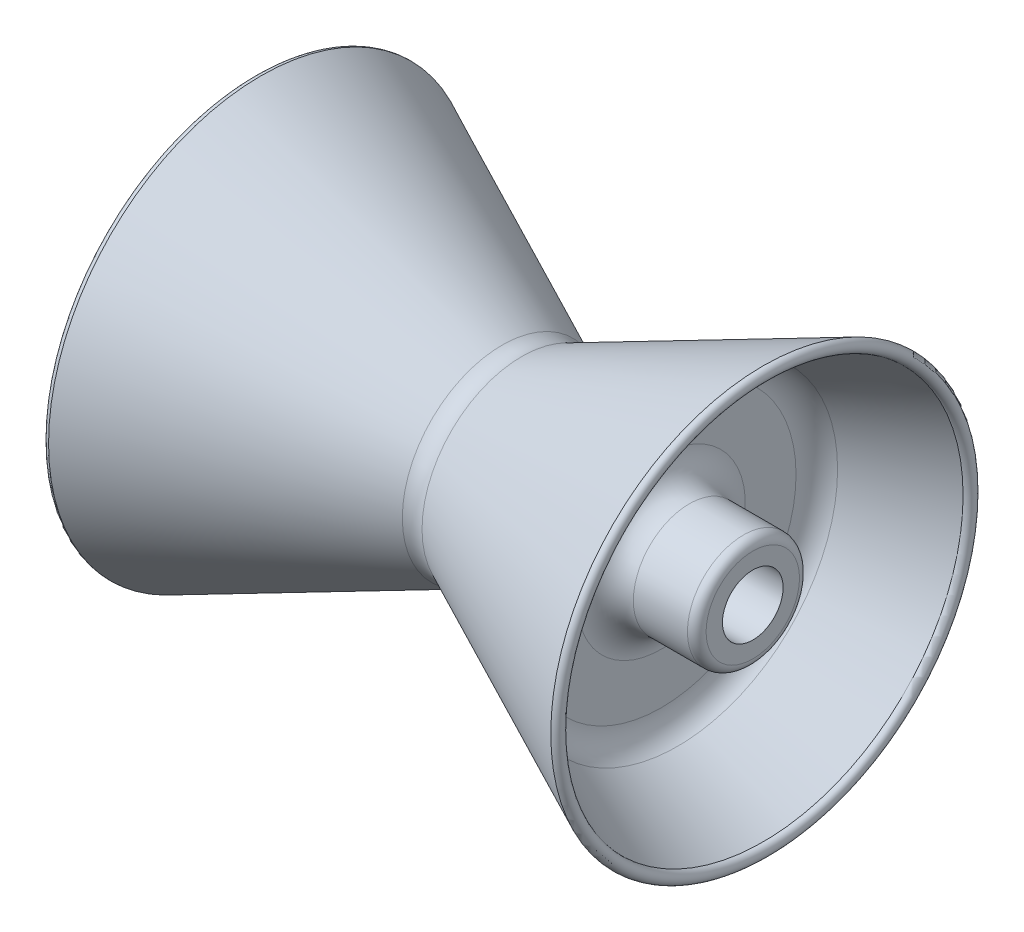
ISO-10303-21;
HEADER;
FILE_DESCRIPTION(('STEP AP214'),'2;1');
FILE_NAME('part.step','',(''),(''),'','','');
FILE_SCHEMA(('AUTOMOTIVE_DESIGN { 1 0 10303 214 1 1 1 1 }'));
ENDSEC;
DATA;
#1=APPLICATION_CONTEXT('core data for automotive mechanical design processes');
#2=APPLICATION_PROTOCOL_DEFINITION('international standard','automotive_design',2000,#1);
#3=PRODUCT_CONTEXT('',#1,'mechanical');
#4=PRODUCT('Part','Part','',(#3));
#5=PRODUCT_RELATED_PRODUCT_CATEGORY('part','',(#4));
#6=PRODUCT_DEFINITION_FORMATION('','',#4);
#7=PRODUCT_DEFINITION_CONTEXT('part definition',#1,'design');
#8=PRODUCT_DEFINITION('design','',#6,#7);
#9=PRODUCT_DEFINITION_SHAPE('','',#8);
#10=(LENGTH_UNIT() NAMED_UNIT(*) SI_UNIT(.MILLI.,.METRE.));
#11=(NAMED_UNIT(*) PLANE_ANGLE_UNIT() SI_UNIT($,.RADIAN.));
#12=(NAMED_UNIT(*) SI_UNIT($,.STERADIAN.) SOLID_ANGLE_UNIT());
#13=UNCERTAINTY_MEASURE_WITH_UNIT(LENGTH_MEASURE(1.E-05),#10,'distance_accuracy_value','');
#14=(GEOMETRIC_REPRESENTATION_CONTEXT(3) GLOBAL_UNCERTAINTY_ASSIGNED_CONTEXT((#13)) GLOBAL_UNIT_ASSIGNED_CONTEXT((#10,
#11,#12)) REPRESENTATION_CONTEXT('',''));
#15=CARTESIAN_POINT('',(0.,0.,0.));
#16=DIRECTION('',(0.,0.,1.));
#17=DIRECTION('',(1.,0.,0.));
#18=AXIS2_PLACEMENT_3D('',#15,#16,#17);
#19=CARTESIAN_POINT('',(-269.015,0.,0.));
#20=DIRECTION('',(-1.,0.,0.));
#21=DIRECTION('',(0.,0.,1.));
#22=AXIS2_PLACEMENT_3D('',#19,#20,#21);
#23=TOROIDAL_SURFACE('',#22,220.839732486225,6.62026751377497);
#24=CARTESIAN_POINT('',(-269.015,0.,0.));
#25=DIRECTION('',(-1.,0.,0.));
#26=DIRECTION('',(0.,0.,1.));
#27=AXIS2_PLACEMENT_3D('',#24,#25,#26);
#28=CIRCLE('',#27,214.21946497245);
#29=CARTESIAN_POINT('',(-269.015,0.,214.21946497245));
#30=VERTEX_POINT('',#29);
#31=EDGE_CURVE('E10',#30,#30,#28,.T.);
#32=ORIENTED_EDGE('',*,*,#31,.F.);
#33=EDGE_LOOP('',(#32));
#34=FACE_BOUND('',#33,.T.);
#35=CARTESIAN_POINT('',(-269.015,0.,0.));
#36=DIRECTION('',(-1.,0.,0.));
#37=DIRECTION('',(0.,0.,1.));
#38=AXIS2_PLACEMENT_3D('',#35,#36,#37);
#39=CIRCLE('',#38,227.46);
#40=CARTESIAN_POINT('',(-269.015,0.,227.46));
#41=VERTEX_POINT('',#40);
#42=EDGE_CURVE('E128',#41,#41,#39,.T.);
#43=ORIENTED_EDGE('',*,*,#42,.T.);
#44=EDGE_LOOP('',(#43));
#45=FACE_BOUND('',#44,.T.);
#46=ADVANCED_FACE('F37',(#34,#45),#23,.T.);
#47=CARTESIAN_POINT('',(-269.015,0.,0.));
#48=DIRECTION('',(-1.,0.,0.));
#49=DIRECTION('',(0.,0.,1.));
#50=AXIS2_PLACEMENT_3D('',#47,#48,#49);
#51=CONICAL_SURFACE('',#50,214.21946497245,0.43633231299858);
#52=CARTESIAN_POINT('',(-177.321452147779,0.,0.));
#53=DIRECTION('',(-1.,0.,0.));
#54=DIRECTION('',(0.,0.,1.));
#55=AXIS2_PLACEMENT_3D('',#52,#53,#54);
#56=CIRCLE('',#55,171.462061405558);
#57=CARTESIAN_POINT('',(-177.321452147779,0.,171.462061405558));
#58=VERTEX_POINT('',#57);
#59=EDGE_CURVE('E43',#58,#58,#56,.T.);
#60=ORIENTED_EDGE('',*,*,#59,.F.);
#61=EDGE_LOOP('',(#60));
#62=FACE_BOUND('',#61,.T.);
#63=ORIENTED_EDGE('',*,*,#31,.T.);
#64=EDGE_LOOP('',(#63));
#65=FACE_BOUND('',#64,.T.);
#66=ADVANCED_FACE('F291',(#62,#65),#51,.F.);
#67=CARTESIAN_POINT('',(-190.,0.,0.));
#68=DIRECTION('',(-1.,0.,0.));
#69=DIRECTION('',(0.,0.,1.));
#70=AXIS2_PLACEMENT_3D('',#67,#68,#69);
#71=TOROIDAL_SURFACE('',#70,144.272827794458,30.);
#72=CARTESIAN_POINT('',(-160.,0.,0.));
#73=DIRECTION('',(-1.,0.,0.));
#74=DIRECTION('',(0.,0.,1.));
#75=AXIS2_PLACEMENT_3D('',#72,#73,#74);
#76=CIRCLE('',#75,144.272827794458);
#77=CARTESIAN_POINT('',(-160.,0.,144.272827794458));
#78=VERTEX_POINT('',#77);
#79=EDGE_CURVE('E47',#78,#78,#76,.T.);
#80=ORIENTED_EDGE('',*,*,#79,.F.);
#81=EDGE_LOOP('',(#80));
#82=FACE_BOUND('',#81,.T.);
#83=ORIENTED_EDGE('',*,*,#59,.T.);
#84=EDGE_LOOP('',(#83));
#85=FACE_BOUND('',#84,.T.);
#86=ADVANCED_FACE('F286',(#82,#85),#71,.F.);
#87=CARTESIAN_POINT('',(-160.,90.0000000000002,0.));
#88=DIRECTION('',(1.,0.,0.));
#89=DIRECTION('',(0.,0.,-1.));
#90=AXIS2_PLACEMENT_3D('',#87,#88,#89);
#91=PLANE('',#90);
#92=CARTESIAN_POINT('',(-160.,0.,0.));
#93=DIRECTION('',(-1.,0.,0.));
#94=DIRECTION('',(0.,0.,1.));
#95=AXIS2_PLACEMENT_3D('',#92,#93,#94);
#96=CIRCLE('',#95,90.0000000000002);
#97=CARTESIAN_POINT('',(-160.,0.,90.0000000000002));
#98=VERTEX_POINT('',#97);
#99=EDGE_CURVE('E51',#98,#98,#96,.T.);
#100=ORIENTED_EDGE('',*,*,#99,.F.);
#101=EDGE_LOOP('',(#100));
#102=FACE_BOUND('',#101,.T.);
#103=ORIENTED_EDGE('',*,*,#79,.T.);
#104=EDGE_LOOP('',(#103));
#105=FACE_BOUND('',#104,.T.);
#106=ADVANCED_FACE('F280',(#102,#105),#91,.F.);
#107=CARTESIAN_POINT('',(-190.,0.,0.));
#108=DIRECTION('',(-1.,0.,0.));
#109=DIRECTION('',(0.,0.,1.));
#110=AXIS2_PLACEMENT_3D('',#107,#108,#109);
#111=TOROIDAL_SURFACE('',#110,90.,30.);
#112=CARTESIAN_POINT('',(-190.,0.,0.));
#113=DIRECTION('',(-1.,0.,0.));
#114=DIRECTION('',(0.,0.,1.));
#115=AXIS2_PLACEMENT_3D('',#112,#113,#114);
#116=CIRCLE('',#115,60.);
#117=CARTESIAN_POINT('',(-190.,0.,60.));
#118=VERTEX_POINT('',#117);
#119=EDGE_CURVE('E56',#118,#118,#116,.T.);
#120=ORIENTED_EDGE('',*,*,#119,.F.);
#121=EDGE_LOOP('',(#120));
#122=FACE_BOUND('',#121,.T.);
#123=ORIENTED_EDGE('',*,*,#99,.T.);
#124=EDGE_LOOP('',(#123));
#125=FACE_BOUND('',#124,.T.);
#126=ADVANCED_FACE('F274',(#122,#125),#111,.F.);
#127=CARTESIAN_POINT('',(-289.83870967742,0.,0.));
#128=DIRECTION('',(-1.,0.,0.));
#129=DIRECTION('',(0.,0.,1.));
#130=AXIS2_PLACEMENT_3D('',#127,#128,#129);
#131=CYLINDRICAL_SURFACE('',#130,60.);
#132=CARTESIAN_POINT('',(-247.940415619254,0.,0.));
#133=DIRECTION('',(-1.,0.,0.));
#134=DIRECTION('',(0.,0.,1.));
#135=AXIS2_PLACEMENT_3D('',#132,#133,#134);
#136=CIRCLE('',#135,60.);
#137=CARTESIAN_POINT('',(-247.940415619254,0.,60.));
#138=VERTEX_POINT('',#137);
#139=EDGE_CURVE('E59',#138,#138,#136,.T.);
#140=ORIENTED_EDGE('',*,*,#139,.F.);
#141=EDGE_LOOP('',(#140));
#142=FACE_BOUND('',#141,.T.);
#143=ORIENTED_EDGE('',*,*,#119,.T.);
#144=EDGE_LOOP('',(#143));
#145=FACE_BOUND('',#144,.T.);
#146=ADVANCED_FACE('F268',(#142,#145),#131,.T.);
#147=CARTESIAN_POINT('',(-247.940415619254,0.,0.));
#148=DIRECTION('',(-1.,0.,0.));
#149=DIRECTION('',(0.,0.,1.));
#150=AXIS2_PLACEMENT_3D('',#147,#148,#149);
#151=TOROIDAL_SURFACE('',#150,50.,10.);
#152=CARTESIAN_POINT('',(-257.940415619254,0.,0.));
#153=DIRECTION('',(-1.,0.,0.));
#154=DIRECTION('',(0.,0.,1.));
#155=AXIS2_PLACEMENT_3D('',#152,#153,#154);
#156=CIRCLE('',#155,49.9999999999999);
#157=CARTESIAN_POINT('',(-257.940415619254,0.,49.9999999999999));
#158=VERTEX_POINT('',#157);
#159=EDGE_CURVE('E62',#158,#158,#156,.T.);
#160=ORIENTED_EDGE('',*,*,#159,.F.);
#161=EDGE_LOOP('',(#160));
#162=FACE_BOUND('',#161,.T.);
#163=ORIENTED_EDGE('',*,*,#139,.T.);
#164=EDGE_LOOP('',(#163));
#165=FACE_BOUND('',#164,.T.);
#166=ADVANCED_FACE('F262',(#162,#165),#151,.T.);
#167=CARTESIAN_POINT('',(-257.940415619254,32.5,0.));
#168=DIRECTION('',(1.,0.,0.));
#169=DIRECTION('',(0.,0.,-1.));
#170=AXIS2_PLACEMENT_3D('',#167,#168,#169);
#171=PLANE('',#170);
#172=CARTESIAN_POINT('',(-257.940415619254,0.,0.));
#173=DIRECTION('',(-1.,0.,0.));
#174=DIRECTION('',(0.,0.,1.));
#175=AXIS2_PLACEMENT_3D('',#172,#173,#174);
#176=CIRCLE('',#175,32.5);
#177=CARTESIAN_POINT('',(-257.940415619254,0.,32.5));
#178=VERTEX_POINT('',#177);
#179=EDGE_CURVE('E65',#178,#178,#176,.T.);
#180=ORIENTED_EDGE('',*,*,#179,.F.);
#181=EDGE_LOOP('',(#180));
#182=FACE_BOUND('',#181,.T.);
#183=ORIENTED_EDGE('',*,*,#159,.T.);
#184=EDGE_LOOP('',(#183));
#185=FACE_BOUND('',#184,.T.);
#186=ADVANCED_FACE('F256',(#182,#185),#171,.F.);
#187=CARTESIAN_POINT('',(-289.83870967742,0.,0.));
#188=DIRECTION('',(-1.,0.,0.));
#189=DIRECTION('',(0.,0.,1.));
#190=AXIS2_PLACEMENT_3D('',#187,#188,#189);
#191=CYLINDRICAL_SURFACE('',#190,32.5);
#192=CARTESIAN_POINT('',(-130.,0.,0.));
#193=DIRECTION('',(-1.,0.,0.));
#194=DIRECTION('',(0.,0.,1.));
#195=AXIS2_PLACEMENT_3D('',#192,#193,#194);
#196=CIRCLE('',#195,32.5);
#197=CARTESIAN_POINT('',(-130.,0.,32.5));
#198=VERTEX_POINT('',#197);
#199=EDGE_CURVE('E68',#198,#198,#196,.T.);
#200=ORIENTED_EDGE('',*,*,#199,.F.);
#201=EDGE_LOOP('',(#200));
#202=FACE_BOUND('',#201,.T.);
#203=ORIENTED_EDGE('',*,*,#179,.T.);
#204=EDGE_LOOP('',(#203));
#205=FACE_BOUND('',#204,.T.);
#206=ADVANCED_FACE('F250',(#202,#205),#191,.F.);
#207=CARTESIAN_POINT('',(-130.,102.305138560509,0.));
#208=DIRECTION('',(-1.,0.,0.));
#209=DIRECTION('',(0.,0.,1.));
#210=AXIS2_PLACEMENT_3D('',#207,#208,#209);
#211=PLANE('',#210);
#212=CARTESIAN_POINT('',(-130.,0.,0.));
#213=DIRECTION('',(-1.,0.,0.));
#214=DIRECTION('',(0.,0.,1.));
#215=AXIS2_PLACEMENT_3D('',#212,#213,#214);
#216=CIRCLE('',#215,102.305138560509);
#217=CARTESIAN_POINT('',(-130.,0.,102.305138560509));
#218=VERTEX_POINT('',#217);
#219=EDGE_CURVE('E71',#218,#218,#216,.T.);
#220=ORIENTED_EDGE('',*,*,#219,.F.);
#221=EDGE_LOOP('',(#220));
#222=FACE_BOUND('',#221,.T.);
#223=ORIENTED_EDGE('',*,*,#199,.T.);
#224=EDGE_LOOP('',(#223));
#225=FACE_BOUND('',#224,.T.);
#226=ADVANCED_FACE('F244',(#222,#225),#211,.F.);
#227=CARTESIAN_POINT('',(-100.,0.,0.));
#228=DIRECTION('',(-1.,0.,0.));
#229=DIRECTION('',(0.,0.,1.));
#230=AXIS2_PLACEMENT_3D('',#227,#228,#229);
#231=TOROIDAL_SURFACE('',#230,102.305138560509,30.);
#232=CARTESIAN_POINT('',(-87.3214521477791,0.,0.));
#233=DIRECTION('',(-1.,0.,0.));
#234=DIRECTION('',(0.,0.,1.));
#235=AXIS2_PLACEMENT_3D('',#232,#233,#234);
#236=CIRCLE('',#235,129.494372171608);
#237=CARTESIAN_POINT('',(-87.3214521477791,0.,129.494372171608));
#238=VERTEX_POINT('',#237);
#239=EDGE_CURVE('E74',#238,#238,#236,.T.);
#240=ORIENTED_EDGE('',*,*,#239,.F.);
#241=EDGE_LOOP('',(#240));
#242=FACE_BOUND('',#241,.T.);
#243=ORIENTED_EDGE('',*,*,#219,.T.);
#244=EDGE_LOOP('',(#243));
#245=FACE_BOUND('',#244,.T.);
#246=ADVANCED_FACE('F238',(#242,#245),#231,.F.);
#247=CARTESIAN_POINT('',(-87.3214521477791,0.,0.));
#248=DIRECTION('',(-1.,0.,0.));
#249=DIRECTION('',(0.,0.,1.));
#250=AXIS2_PLACEMENT_3D('',#247,#248,#249);
#251=CONICAL_SURFACE('',#250,129.494372171608,0.43633231299858);
#252=CARTESIAN_POINT('',(-2.88690869129654,0.,0.));
#253=DIRECTION('',(-1.,0.,0.));
#254=DIRECTION('',(0.,0.,1.));
#255=AXIS2_PLACEMENT_3D('',#252,#253,#254);
#256=CIRCLE('',#255,90.1218979450298);
#257=CARTESIAN_POINT('',(-2.88690869129654,0.,90.1218979450298));
#258=VERTEX_POINT('',#257);
#259=EDGE_CURVE('E77',#258,#258,#256,.T.);
#260=ORIENTED_EDGE('',*,*,#259,.F.);
#261=EDGE_LOOP('',(#260));
#262=FACE_BOUND('',#261,.T.);
#263=ORIENTED_EDGE('',*,*,#239,.T.);
#264=EDGE_LOOP('',(#263));
#265=FACE_BOUND('',#264,.T.);
#266=ADVANCED_FACE('F232',(#262,#265),#251,.F.);
#267=CARTESIAN_POINT('',(-5.,0.,0.));
#268=DIRECTION('',(-1.,0.,0.));
#269=DIRECTION('',(0.,0.,1.));
#270=AXIS2_PLACEMENT_3D('',#267,#268,#269);
#271=TOROIDAL_SURFACE('',#270,85.5903590098465,5.);
#272=CARTESIAN_POINT('',(0.,0.,0.));
#273=DIRECTION('',(-1.,0.,0.));
#274=DIRECTION('',(0.,0.,1.));
#275=AXIS2_PLACEMENT_3D('',#272,#273,#274);
#276=CIRCLE('',#275,85.5903590098465);
#277=CARTESIAN_POINT('',(0.,0.,85.5903590098465));
#278=VERTEX_POINT('',#277);
#279=EDGE_CURVE('E80',#278,#278,#276,.T.);
#280=ORIENTED_EDGE('',*,*,#279,.F.);
#281=EDGE_LOOP('',(#280));
#282=FACE_BOUND('',#281,.T.);
#283=ORIENTED_EDGE('',*,*,#259,.T.);
#284=EDGE_LOOP('',(#283));
#285=FACE_BOUND('',#284,.T.);
#286=ADVANCED_FACE('F226',(#282,#285),#271,.F.);
#287=CARTESIAN_POINT('',(5.,0.,0.));
#288=DIRECTION('',(-1.,0.,0.));
#289=DIRECTION('',(0.,0.,1.));
#290=AXIS2_PLACEMENT_3D('',#287,#288,#289);
#291=TOROIDAL_SURFACE('',#290,85.5903590098465,5.);
#292=CARTESIAN_POINT('',(2.88690869129654,0.,0.));
#293=DIRECTION('',(-1.,0.,0.));
#294=DIRECTION('',(0.,0.,1.));
#295=AXIS2_PLACEMENT_3D('',#292,#293,#294);
#296=CIRCLE('',#295,90.1218979450298);
#297=CARTESIAN_POINT('',(2.88690869129654,0.,90.1218979450298));
#298=VERTEX_POINT('',#297);
#299=EDGE_CURVE('E83',#298,#298,#296,.T.);
#300=ORIENTED_EDGE('',*,*,#299,.F.);
#301=EDGE_LOOP('',(#300));
#302=FACE_BOUND('',#301,.T.);
#303=ORIENTED_EDGE('',*,*,#279,.T.);
#304=EDGE_LOOP('',(#303));
#305=FACE_BOUND('',#304,.T.);
#306=ADVANCED_FACE('F220',(#302,#305),#291,.F.);
#307=CARTESIAN_POINT('',(2.88690869129654,0.,0.));
#308=DIRECTION('',(1.,0.,0.));
#309=DIRECTION('',(0.,0.,-1.));
#310=AXIS2_PLACEMENT_3D('',#307,#308,#309);
#311=CONICAL_SURFACE('',#310,90.1218979450298,0.43633231299858);
#312=CARTESIAN_POINT('',(87.3214521477791,0.,0.));
#313=DIRECTION('',(-1.,0.,0.));
#314=DIRECTION('',(0.,0.,1.));
#315=AXIS2_PLACEMENT_3D('',#312,#313,#314);
#316=CIRCLE('',#315,129.494372171608);
#317=CARTESIAN_POINT('',(87.3214521477791,0.,129.494372171608));
#318=VERTEX_POINT('',#317);
#319=EDGE_CURVE('E86',#318,#318,#316,.T.);
#320=ORIENTED_EDGE('',*,*,#319,.F.);
#321=EDGE_LOOP('',(#320));
#322=FACE_BOUND('',#321,.T.);
#323=ORIENTED_EDGE('',*,*,#299,.T.);
#324=EDGE_LOOP('',(#323));
#325=FACE_BOUND('',#324,.T.);
#326=ADVANCED_FACE('F214',(#322,#325),#311,.F.);
#327=CARTESIAN_POINT('',(100.,0.,0.));
#328=DIRECTION('',(-1.,0.,0.));
#329=DIRECTION('',(0.,0.,1.));
#330=AXIS2_PLACEMENT_3D('',#327,#328,#329);
#331=TOROIDAL_SURFACE('',#330,102.305138560509,30.);
#332=CARTESIAN_POINT('',(130.,0.,0.));
#333=DIRECTION('',(-1.,0.,0.));
#334=DIRECTION('',(0.,0.,1.));
#335=AXIS2_PLACEMENT_3D('',#332,#333,#334);
#336=CIRCLE('',#335,102.305138560509);
#337=CARTESIAN_POINT('',(130.,0.,102.305138560509));
#338=VERTEX_POINT('',#337);
#339=EDGE_CURVE('E89',#338,#338,#336,.T.);
#340=ORIENTED_EDGE('',*,*,#339,.F.);
#341=EDGE_LOOP('',(#340));
#342=FACE_BOUND('',#341,.T.);
#343=ORIENTED_EDGE('',*,*,#319,.T.);
#344=EDGE_LOOP('',(#343));
#345=FACE_BOUND('',#344,.T.);
#346=ADVANCED_FACE('F208',(#342,#345),#331,.F.);
#347=CARTESIAN_POINT('',(130.,102.305138560509,0.));
#348=DIRECTION('',(1.,0.,0.));
#349=DIRECTION('',(0.,0.,-1.));
#350=AXIS2_PLACEMENT_3D('',#347,#348,#349);
#351=PLANE('',#350);
#352=CARTESIAN_POINT('',(130.,0.,0.));
#353=DIRECTION('',(-1.,0.,0.));
#354=DIRECTION('',(0.,0.,1.));
#355=AXIS2_PLACEMENT_3D('',#352,#353,#354);
#356=CIRCLE('',#355,32.5);
#357=CARTESIAN_POINT('',(130.,0.,32.5));
#358=VERTEX_POINT('',#357);
#359=EDGE_CURVE('E92',#358,#358,#356,.T.);
#360=ORIENTED_EDGE('',*,*,#359,.F.);
#361=EDGE_LOOP('',(#360));
#362=FACE_BOUND('',#361,.T.);
#363=ORIENTED_EDGE('',*,*,#339,.T.);
#364=EDGE_LOOP('',(#363));
#365=FACE_BOUND('',#364,.T.);
#366=ADVANCED_FACE('F202',(#362,#365),#351,.F.);
#367=CARTESIAN_POINT('',(-289.83870967742,0.,0.));
#368=DIRECTION('',(-1.,0.,0.));
#369=DIRECTION('',(0.,0.,1.));
#370=AXIS2_PLACEMENT_3D('',#367,#368,#369);
#371=CYLINDRICAL_SURFACE('',#370,32.5);
#372=CARTESIAN_POINT('',(257.940415619254,0.,0.));
#373=DIRECTION('',(-1.,0.,0.));
#374=DIRECTION('',(0.,0.,1.));
#375=AXIS2_PLACEMENT_3D('',#372,#373,#374);
#376=CIRCLE('',#375,32.5);
#377=CARTESIAN_POINT('',(257.940415619254,0.,32.5));
#378=VERTEX_POINT('',#377);
#379=EDGE_CURVE('E95',#378,#378,#376,.T.);
#380=ORIENTED_EDGE('',*,*,#379,.F.);
#381=EDGE_LOOP('',(#380));
#382=FACE_BOUND('',#381,.T.);
#383=ORIENTED_EDGE('',*,*,#359,.T.);
#384=EDGE_LOOP('',(#383));
#385=FACE_BOUND('',#384,.T.);
#386=ADVANCED_FACE('F196',(#382,#385),#371,.F.);
#387=CARTESIAN_POINT('',(257.940415619254,32.5,0.));
#388=DIRECTION('',(-1.,0.,0.));
#389=DIRECTION('',(0.,0.,1.));
#390=AXIS2_PLACEMENT_3D('',#387,#388,#389);
#391=PLANE('',#390);
#392=CARTESIAN_POINT('',(257.940415619254,0.,0.));
#393=DIRECTION('',(-1.,0.,0.));
#394=DIRECTION('',(0.,0.,1.));
#395=AXIS2_PLACEMENT_3D('',#392,#393,#394);
#396=CIRCLE('',#395,49.9999999999999);
#397=CARTESIAN_POINT('',(257.940415619254,0.,49.9999999999999));
#398=VERTEX_POINT('',#397);
#399=EDGE_CURVE('E98',#398,#398,#396,.T.);
#400=ORIENTED_EDGE('',*,*,#399,.F.);
#401=EDGE_LOOP('',(#400));
#402=FACE_BOUND('',#401,.T.);
#403=ORIENTED_EDGE('',*,*,#379,.T.);
#404=EDGE_LOOP('',(#403));
#405=FACE_BOUND('',#404,.T.);
#406=ADVANCED_FACE('F190',(#402,#405),#391,.F.);
#407=CARTESIAN_POINT('',(247.940415619254,0.,0.));
#408=DIRECTION('',(-1.,0.,0.));
#409=DIRECTION('',(0.,0.,1.));
#410=AXIS2_PLACEMENT_3D('',#407,#408,#409);
#411=TOROIDAL_SURFACE('',#410,50.,10.);
#412=CARTESIAN_POINT('',(247.940415619254,0.,0.));
#413=DIRECTION('',(-1.,0.,0.));
#414=DIRECTION('',(0.,0.,1.));
#415=AXIS2_PLACEMENT_3D('',#412,#413,#414);
#416=CIRCLE('',#415,60.);
#417=CARTESIAN_POINT('',(247.940415619254,0.,60.));
#418=VERTEX_POINT('',#417);
#419=EDGE_CURVE('E101',#418,#418,#416,.T.);
#420=ORIENTED_EDGE('',*,*,#419,.F.);
#421=EDGE_LOOP('',(#420));
#422=FACE_BOUND('',#421,.T.);
#423=ORIENTED_EDGE('',*,*,#399,.T.);
#424=EDGE_LOOP('',(#423));
#425=FACE_BOUND('',#424,.T.);
#426=ADVANCED_FACE('F184',(#422,#425),#411,.T.);
#427=CARTESIAN_POINT('',(-289.83870967742,0.,0.));
#428=DIRECTION('',(-1.,0.,0.));
#429=DIRECTION('',(0.,0.,1.));
#430=AXIS2_PLACEMENT_3D('',#427,#428,#429);
#431=CYLINDRICAL_SURFACE('',#430,60.);
#432=CARTESIAN_POINT('',(190.,0.,0.));
#433=DIRECTION('',(-1.,0.,0.));
#434=DIRECTION('',(0.,0.,1.));
#435=AXIS2_PLACEMENT_3D('',#432,#433,#434);
#436=CIRCLE('',#435,60.);
#437=CARTESIAN_POINT('',(190.,0.,60.));
#438=VERTEX_POINT('',#437);
#439=EDGE_CURVE('E104',#438,#438,#436,.T.);
#440=ORIENTED_EDGE('',*,*,#439,.F.);
#441=EDGE_LOOP('',(#440));
#442=FACE_BOUND('',#441,.T.);
#443=ORIENTED_EDGE('',*,*,#419,.T.);
#444=EDGE_LOOP('',(#443));
#445=FACE_BOUND('',#444,.T.);
#446=ADVANCED_FACE('F178',(#442,#445),#431,.T.);
#447=CARTESIAN_POINT('',(190.,0.,0.));
#448=DIRECTION('',(-1.,0.,0.));
#449=DIRECTION('',(0.,0.,1.));
#450=AXIS2_PLACEMENT_3D('',#447,#448,#449);
#451=TOROIDAL_SURFACE('',#450,90.,30.);
#452=CARTESIAN_POINT('',(160.,0.,0.));
#453=DIRECTION('',(-1.,0.,0.));
#454=DIRECTION('',(0.,0.,1.));
#455=AXIS2_PLACEMENT_3D('',#452,#453,#454);
#456=CIRCLE('',#455,90.);
#457=CARTESIAN_POINT('',(160.,0.,90.));
#458=VERTEX_POINT('',#457);
#459=EDGE_CURVE('E107',#458,#458,#456,.T.);
#460=ORIENTED_EDGE('',*,*,#459,.F.);
#461=EDGE_LOOP('',(#460));
#462=FACE_BOUND('',#461,.T.);
#463=ORIENTED_EDGE('',*,*,#439,.T.);
#464=EDGE_LOOP('',(#463));
#465=FACE_BOUND('',#464,.T.);
#466=ADVANCED_FACE('F172',(#462,#465),#451,.F.);
#467=CARTESIAN_POINT('',(160.,90.0000000000002,0.));
#468=DIRECTION('',(-1.,0.,0.));
#469=DIRECTION('',(0.,0.,1.));
#470=AXIS2_PLACEMENT_3D('',#467,#468,#469);
#471=PLANE('',#470);
#472=CARTESIAN_POINT('',(160.,0.,0.));
#473=DIRECTION('',(-1.,0.,0.));
#474=DIRECTION('',(0.,0.,1.));
#475=AXIS2_PLACEMENT_3D('',#472,#473,#474);
#476=CIRCLE('',#475,144.272827794458);
#477=CARTESIAN_POINT('',(160.,0.,144.272827794458));
#478=VERTEX_POINT('',#477);
#479=EDGE_CURVE('E110',#478,#478,#476,.T.);
#480=ORIENTED_EDGE('',*,*,#479,.F.);
#481=EDGE_LOOP('',(#480));
#482=FACE_BOUND('',#481,.T.);
#483=ORIENTED_EDGE('',*,*,#459,.T.);
#484=EDGE_LOOP('',(#483));
#485=FACE_BOUND('',#484,.T.);
#486=ADVANCED_FACE('F166',(#482,#485),#471,.F.);
#487=CARTESIAN_POINT('',(190.,0.,0.));
#488=DIRECTION('',(-1.,0.,0.));
#489=DIRECTION('',(0.,0.,1.));
#490=AXIS2_PLACEMENT_3D('',#487,#488,#489);
#491=TOROIDAL_SURFACE('',#490,144.272827794458,30.);
#492=CARTESIAN_POINT('',(177.321452147779,0.,0.));
#493=DIRECTION('',(-1.,0.,0.));
#494=DIRECTION('',(0.,0.,1.));
#495=AXIS2_PLACEMENT_3D('',#492,#493,#494);
#496=CIRCLE('',#495,171.462061405558);
#497=CARTESIAN_POINT('',(177.321452147779,0.,171.462061405558));
#498=VERTEX_POINT('',#497);
#499=EDGE_CURVE('E113',#498,#498,#496,.T.);
#500=ORIENTED_EDGE('',*,*,#499,.F.);
#501=EDGE_LOOP('',(#500));
#502=FACE_BOUND('',#501,.T.);
#503=ORIENTED_EDGE('',*,*,#479,.T.);
#504=EDGE_LOOP('',(#503));
#505=FACE_BOUND('',#504,.T.);
#506=ADVANCED_FACE('F160',(#502,#505),#491,.F.);
#507=CARTESIAN_POINT('',(177.321452147779,0.,0.));
#508=DIRECTION('',(1.,0.,0.));
#509=DIRECTION('',(0.,0.,-1.));
#510=AXIS2_PLACEMENT_3D('',#507,#508,#509);
#511=CONICAL_SURFACE('',#510,171.462061405558,0.43633231299858);
#512=CARTESIAN_POINT('',(269.015,0.,0.));
#513=DIRECTION('',(-1.,0.,0.));
#514=DIRECTION('',(0.,0.,1.));
#515=AXIS2_PLACEMENT_3D('',#512,#513,#514);
#516=CIRCLE('',#515,214.21946497245);
#517=CARTESIAN_POINT('',(269.015,0.,214.21946497245));
#518=VERTEX_POINT('',#517);
#519=EDGE_CURVE('E116',#518,#518,#516,.T.);
#520=ORIENTED_EDGE('',*,*,#519,.F.);
#521=EDGE_LOOP('',(#520));
#522=FACE_BOUND('',#521,.T.);
#523=ORIENTED_EDGE('',*,*,#499,.T.);
#524=EDGE_LOOP('',(#523));
#525=FACE_BOUND('',#524,.T.);
#526=ADVANCED_FACE('F154',(#522,#525),#511,.F.);
#527=CARTESIAN_POINT('',(269.015,0.,0.));
#528=DIRECTION('',(-1.,0.,0.));
#529=DIRECTION('',(0.,0.,1.));
#530=AXIS2_PLACEMENT_3D('',#527,#528,#529);
#531=TOROIDAL_SURFACE('',#530,220.839732486225,6.62026751377497);
#532=CARTESIAN_POINT('',(269.015,0.,0.));
#533=DIRECTION('',(-1.,0.,0.));
#534=DIRECTION('',(0.,0.,1.));
#535=AXIS2_PLACEMENT_3D('',#532,#533,#534);
#536=CIRCLE('',#535,227.46);
#537=CARTESIAN_POINT('',(269.015,0.,227.46));
#538=VERTEX_POINT('',#537);
#539=EDGE_CURVE('E119',#538,#538,#536,.T.);
#540=ORIENTED_EDGE('',*,*,#539,.F.);
#541=EDGE_LOOP('',(#540));
#542=FACE_BOUND('',#541,.T.);
#543=ORIENTED_EDGE('',*,*,#519,.T.);
#544=EDGE_LOOP('',(#543));
#545=FACE_BOUND('',#544,.T.);
#546=ADVANCED_FACE('F148',(#542,#545),#531,.T.);
#547=CARTESIAN_POINT('',(269.015,0.,0.));
#548=DIRECTION('',(1.,0.,0.));
#549=DIRECTION('',(0.,0.,-1.));
#550=AXIS2_PLACEMENT_3D('',#547,#548,#549);
#551=CONICAL_SURFACE('',#550,227.46,0.43633231299858);
#552=CARTESIAN_POINT('',(10.5654565435175,0.,0.));
#553=DIRECTION('',(-1.,0.,0.));
#554=DIRECTION('',(0.,0.,1.));
#555=AXIS2_PLACEMENT_3D('',#552,#553,#554);
#556=CIRCLE('',#555,106.94299863958);
#557=CARTESIAN_POINT('',(10.5654565435175,0.,106.94299863958));
#558=VERTEX_POINT('',#557);
#559=EDGE_CURVE('E122',#558,#558,#556,.T.);
#560=ORIENTED_EDGE('',*,*,#559,.F.);
#561=EDGE_LOOP('',(#560));
#562=FACE_BOUND('',#561,.T.);
#563=ORIENTED_EDGE('',*,*,#539,.T.);
#564=EDGE_LOOP('',(#563));
#565=FACE_BOUND('',#564,.T.);
#566=ADVANCED_FACE('F142',(#562,#565),#551,.T.);
#567=CARTESIAN_POINT('',(0.,0.,0.));
#568=DIRECTION('',(-1.,0.,0.));
#569=DIRECTION('',(0.,0.,1.));
#570=AXIS2_PLACEMENT_3D('',#567,#568,#569);
#571=TOROIDAL_SURFACE('',#570,129.600693315496,25.);
#572=CARTESIAN_POINT('',(-10.5654565435175,0.,0.));
#573=DIRECTION('',(-1.,0.,0.));
#574=DIRECTION('',(0.,0.,1.));
#575=AXIS2_PLACEMENT_3D('',#572,#573,#574);
#576=CIRCLE('',#575,106.94299863958);
#577=CARTESIAN_POINT('',(-10.5654565435175,0.,106.94299863958));
#578=VERTEX_POINT('',#577);
#579=EDGE_CURVE('E125',#578,#578,#576,.T.);
#580=ORIENTED_EDGE('',*,*,#579,.F.);
#581=EDGE_LOOP('',(#580));
#582=FACE_BOUND('',#581,.T.);
#583=ORIENTED_EDGE('',*,*,#559,.T.);
#584=EDGE_LOOP('',(#583));
#585=FACE_BOUND('',#584,.T.);
#586=ADVANCED_FACE('F136',(#582,#585),#571,.F.);
#587=CARTESIAN_POINT('',(-10.5654565435175,0.,0.));
#588=DIRECTION('',(-1.,0.,0.));
#589=DIRECTION('',(0.,0.,1.));
#590=AXIS2_PLACEMENT_3D('',#587,#588,#589);
#591=CONICAL_SURFACE('',#590,106.94299863958,0.43633231299858);
#592=ORIENTED_EDGE('',*,*,#42,.F.);
#593=EDGE_LOOP('',(#592));
#594=FACE_BOUND('',#593,.T.);
#595=ORIENTED_EDGE('',*,*,#579,.T.);
#596=EDGE_LOOP('',(#595));
#597=FACE_BOUND('',#596,.T.);
#598=ADVANCED_FACE('F133',(#594,#597),#591,.T.);
#599=CLOSED_SHELL('',(#46,#66,#86,#106,#126,#146,#166,#186,#206,#226,#246,#266,#286,#306,#326,
#346,#366,#386,#406,#426,#446,#466,#486,#506,#526,#546,#566,#586,#598));
#600=MANIFOLD_SOLID_BREP('B2',#599);
#601=ADVANCED_BREP_SHAPE_REPRESENTATION('',(#18,#600),#14);
#602=SHAPE_DEFINITION_REPRESENTATION(#9,#601);
ENDSEC;
END-ISO-10303-21;
